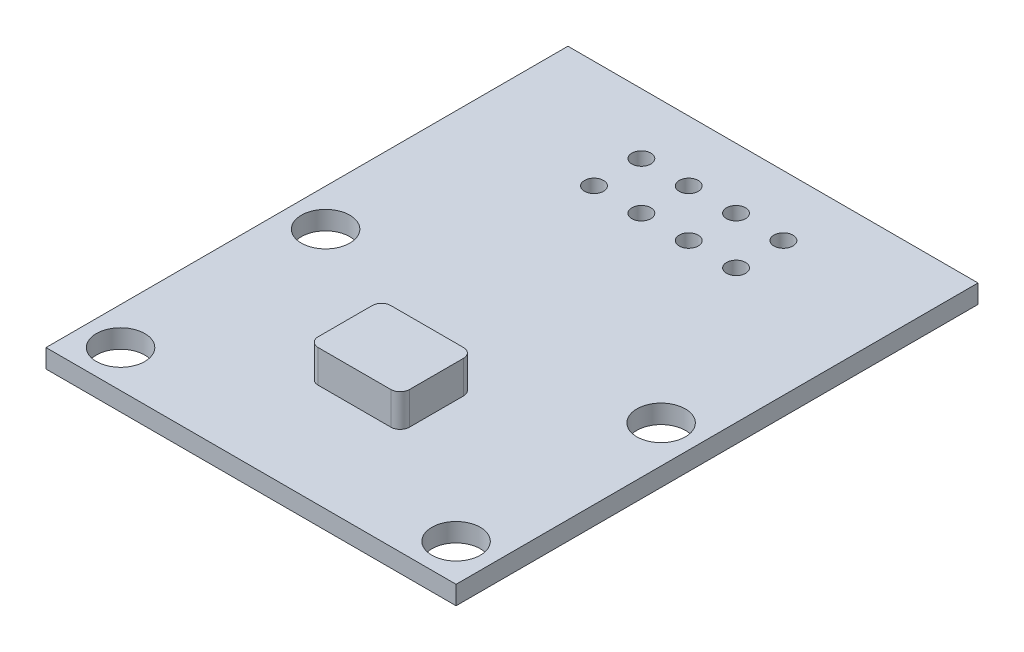
ISO-10303-21;
HEADER;
FILE_DESCRIPTION(('STEP AP214'),'2;1');
FILE_NAME('part.step','',(''),(''),'','','');
FILE_SCHEMA(('AUTOMOTIVE_DESIGN { 1 0 10303 214 1 1 1 1 }'));
ENDSEC;
DATA;
#1=APPLICATION_CONTEXT('core data for automotive mechanical design processes');
#2=APPLICATION_PROTOCOL_DEFINITION('international standard','automotive_design',2000,#1);
#3=PRODUCT_CONTEXT('',#1,'mechanical');
#4=PRODUCT('Part','Part','',(#3));
#5=PRODUCT_RELATED_PRODUCT_CATEGORY('part','',(#4));
#6=PRODUCT_DEFINITION_FORMATION('','',#4);
#7=PRODUCT_DEFINITION_CONTEXT('part definition',#1,'design');
#8=PRODUCT_DEFINITION('design','',#6,#7);
#9=PRODUCT_DEFINITION_SHAPE('','',#8);
#10=(LENGTH_UNIT() NAMED_UNIT(*) SI_UNIT(.MILLI.,.METRE.));
#11=(NAMED_UNIT(*) PLANE_ANGLE_UNIT() SI_UNIT($,.RADIAN.));
#12=(NAMED_UNIT(*) SI_UNIT($,.STERADIAN.) SOLID_ANGLE_UNIT());
#13=UNCERTAINTY_MEASURE_WITH_UNIT(LENGTH_MEASURE(1.E-05),#10,'distance_accuracy_value','');
#14=(GEOMETRIC_REPRESENTATION_CONTEXT(3) GLOBAL_UNCERTAINTY_ASSIGNED_CONTEXT((#13)) GLOBAL_UNIT_ASSIGNED_CONTEXT((#10,
#11,#12)) REPRESENTATION_CONTEXT('',''));
#15=CARTESIAN_POINT('',(0.,0.,0.));
#16=DIRECTION('',(0.,0.,1.));
#17=DIRECTION('',(1.,0.,0.));
#18=AXIS2_PLACEMENT_3D('',#15,#16,#17);
#19=CARTESIAN_POINT('',(0.,1.,0.));
#20=DIRECTION('',(0.,-1.,0.));
#21=DIRECTION('',(0.,0.,-1.));
#22=AXIS2_PLACEMENT_3D('',#19,#20,#21);
#23=PLANE('',#22);
#24=CARTESIAN_POINT('',(7.19,1.,-22.2099999999999));
#25=DIRECTION('',(0.,1.,0.));
#26=DIRECTION('',(0.,0.,1.));
#27=AXIS2_PLACEMENT_3D('',#24,#25,#26);
#28=CIRCLE('',#27,0.51);
#29=CARTESIAN_POINT('',(7.19,1.,-21.6999999999999));
#30=VERTEX_POINT('',#29);
#31=EDGE_CURVE('E146',#30,#30,#28,.T.);
#32=ORIENTED_EDGE('',*,*,#31,.F.);
#33=EDGE_LOOP('',(#32));
#34=FACE_BOUND('',#33,.T.);
#35=CARTESIAN_POINT('',(9.73,1.,-22.21));
#36=DIRECTION('',(0.,1.,0.));
#37=DIRECTION('',(0.,0.,1.));
#38=AXIS2_PLACEMENT_3D('',#35,#36,#37);
#39=CIRCLE('',#38,0.51);
#40=CARTESIAN_POINT('',(9.73,1.,-21.7));
#41=VERTEX_POINT('',#40);
#42=EDGE_CURVE('E155',#41,#41,#39,.T.);
#43=ORIENTED_EDGE('',*,*,#42,.F.);
#44=EDGE_LOOP('',(#43));
#45=FACE_BOUND('',#44,.T.);
#46=CARTESIAN_POINT('',(12.27,1.,-22.21));
#47=DIRECTION('',(0.,1.,0.));
#48=DIRECTION('',(0.,0.,1.));
#49=AXIS2_PLACEMENT_3D('',#46,#47,#48);
#50=CIRCLE('',#49,0.51);
#51=CARTESIAN_POINT('',(12.27,1.,-21.7));
#52=VERTEX_POINT('',#51);
#53=EDGE_CURVE('E161',#52,#52,#50,.T.);
#54=ORIENTED_EDGE('',*,*,#53,.F.);
#55=EDGE_LOOP('',(#54));
#56=FACE_BOUND('',#55,.T.);
#57=CARTESIAN_POINT('',(7.19,1.,-24.75));
#58=DIRECTION('',(0.,1.,0.));
#59=DIRECTION('',(0.,0.,1.));
#60=AXIS2_PLACEMENT_3D('',#57,#58,#59);
#61=CIRCLE('',#60,0.51);
#62=CARTESIAN_POINT('',(7.19,1.,-24.2399999999999));
#63=VERTEX_POINT('',#62);
#64=EDGE_CURVE('E167',#63,#63,#61,.T.);
#65=ORIENTED_EDGE('',*,*,#64,.F.);
#66=EDGE_LOOP('',(#65));
#67=FACE_BOUND('',#66,.T.);
#68=CARTESIAN_POINT('',(9.73,1.,-24.75));
#69=DIRECTION('',(0.,1.,0.));
#70=DIRECTION('',(0.,0.,1.));
#71=AXIS2_PLACEMENT_3D('',#68,#69,#70);
#72=CIRCLE('',#71,0.51);
#73=CARTESIAN_POINT('',(9.73,1.,-24.24));
#74=VERTEX_POINT('',#73);
#75=EDGE_CURVE('E173',#74,#74,#72,.T.);
#76=ORIENTED_EDGE('',*,*,#75,.F.);
#77=EDGE_LOOP('',(#76));
#78=FACE_BOUND('',#77,.T.);
#79=CARTESIAN_POINT('',(12.27,1.,-24.75));
#80=DIRECTION('',(0.,1.,0.));
#81=DIRECTION('',(0.,0.,1.));
#82=AXIS2_PLACEMENT_3D('',#79,#80,#81);
#83=CIRCLE('',#82,0.51);
#84=CARTESIAN_POINT('',(12.27,1.,-24.24));
#85=VERTEX_POINT('',#84);
#86=EDGE_CURVE('E179',#85,#85,#83,.T.);
#87=ORIENTED_EDGE('',*,*,#86,.F.);
#88=EDGE_LOOP('',(#87));
#89=FACE_BOUND('',#88,.T.);
#90=CARTESIAN_POINT('',(14.81,1.,-22.21));
#91=DIRECTION('',(0.,1.,0.));
#92=DIRECTION('',(0.,0.,1.));
#93=AXIS2_PLACEMENT_3D('',#90,#91,#92);
#94=CIRCLE('',#93,0.51);
#95=CARTESIAN_POINT('',(14.81,1.,-21.7));
#96=VERTEX_POINT('',#95);
#97=EDGE_CURVE('E185',#96,#96,#94,.T.);
#98=ORIENTED_EDGE('',*,*,#97,.F.);
#99=EDGE_LOOP('',(#98));
#100=FACE_BOUND('',#99,.T.);
#101=CARTESIAN_POINT('',(14.81,1.,-24.75));
#102=DIRECTION('',(0.,1.,0.));
#103=DIRECTION('',(0.,0.,1.));
#104=AXIS2_PLACEMENT_3D('',#101,#102,#103);
#105=CIRCLE('',#104,0.51);
#106=CARTESIAN_POINT('',(14.81,1.,-24.24));
#107=VERTEX_POINT('',#106);
#108=EDGE_CURVE('E191',#107,#107,#105,.T.);
#109=ORIENTED_EDGE('',*,*,#108,.F.);
#110=EDGE_LOOP('',(#109));
#111=FACE_BOUND('',#110,.T.);
#112=CARTESIAN_POINT('',(2.,1.,-13.));
#113=DIRECTION('',(0.,1.,0.));
#114=DIRECTION('',(0.,0.,1.));
#115=AXIS2_PLACEMENT_3D('',#112,#113,#114);
#116=CIRCLE('',#115,1.3);
#117=CARTESIAN_POINT('',(2.,1.,-11.7));
#118=VERTEX_POINT('',#117);
#119=EDGE_CURVE('E197',#118,#118,#116,.T.);
#120=ORIENTED_EDGE('',*,*,#119,.F.);
#121=EDGE_LOOP('',(#120));
#122=FACE_BOUND('',#121,.T.);
#123=CARTESIAN_POINT('',(20.,1.,-13.));
#124=DIRECTION('',(0.,1.,0.));
#125=DIRECTION('',(0.,0.,1.));
#126=AXIS2_PLACEMENT_3D('',#123,#124,#125);
#127=CIRCLE('',#126,1.3);
#128=CARTESIAN_POINT('',(20.,1.,-11.7));
#129=VERTEX_POINT('',#128);
#130=EDGE_CURVE('E203',#129,#129,#127,.T.);
#131=ORIENTED_EDGE('',*,*,#130,.F.);
#132=EDGE_LOOP('',(#131));
#133=FACE_BOUND('',#132,.T.);
#134=CARTESIAN_POINT('',(20.,1.,-2.));
#135=DIRECTION('',(0.,1.,0.));
#136=DIRECTION('',(0.,0.,1.));
#137=AXIS2_PLACEMENT_3D('',#134,#135,#136);
#138=CIRCLE('',#137,1.3);
#139=CARTESIAN_POINT('',(20.,1.,-0.700000000000002));
#140=VERTEX_POINT('',#139);
#141=EDGE_CURVE('E209',#140,#140,#138,.T.);
#142=ORIENTED_EDGE('',*,*,#141,.F.);
#143=EDGE_LOOP('',(#142));
#144=FACE_BOUND('',#143,.T.);
#145=CARTESIAN_POINT('',(2.,1.,-2.));
#146=DIRECTION('',(0.,1.,0.));
#147=DIRECTION('',(0.,0.,1.));
#148=AXIS2_PLACEMENT_3D('',#145,#146,#147);
#149=CIRCLE('',#148,1.3);
#150=CARTESIAN_POINT('',(2.,1.,-0.700000000000001));
#151=VERTEX_POINT('',#150);
#152=EDGE_CURVE('E215',#151,#151,#149,.T.);
#153=ORIENTED_EDGE('',*,*,#152,.F.);
#154=EDGE_LOOP('',(#153));
#155=FACE_BOUND('',#154,.T.);
#156=DIRECTION('',(0.,0.,1.));
#157=VECTOR('',#156,1.);
#158=CARTESIAN_POINT('',(0.,1.,0.));
#159=LINE('',#158,#157);
#160=CARTESIAN_POINT('',(0.,1.,-28.));
#161=VERTEX_POINT('',#160);
#162=CARTESIAN_POINT('',(0.,1.,0.));
#163=VERTEX_POINT('',#162);
#164=EDGE_CURVE('E221',#161,#163,#159,.T.);
#165=ORIENTED_EDGE('',*,*,#164,.T.);
#166=DIRECTION('',(1.,0.,0.));
#167=VECTOR('',#166,1.);
#168=CARTESIAN_POINT('',(0.,1.,0.));
#169=LINE('',#168,#167);
#170=CARTESIAN_POINT('',(22.,1.,0.));
#171=VERTEX_POINT('',#170);
#172=EDGE_CURVE('E224',#163,#171,#169,.T.);
#173=ORIENTED_EDGE('',*,*,#172,.T.);
#174=DIRECTION('',(0.,0.,-1.));
#175=VECTOR('',#174,1.);
#176=CARTESIAN_POINT('',(22.,1.,0.));
#177=LINE('',#176,#175);
#178=CARTESIAN_POINT('',(22.,1.,-28.));
#179=VERTEX_POINT('',#178);
#180=EDGE_CURVE('E227',#171,#179,#177,.T.);
#181=ORIENTED_EDGE('',*,*,#180,.T.);
#182=DIRECTION('',(-1.,0.,0.));
#183=VECTOR('',#182,1.);
#184=CARTESIAN_POINT('',(0.,1.,-28.));
#185=LINE('',#184,#183);
#186=EDGE_CURVE('E229',#179,#161,#185,.T.);
#187=ORIENTED_EDGE('',*,*,#186,.T.);
#188=EDGE_LOOP('',(#165,#173,#181,#187));
#189=FACE_BOUND('',#188,.T.);
#190=CARTESIAN_POINT('',(9.05,1.,-6.05));
#191=DIRECTION('',(0.,1.,0.));
#192=DIRECTION('',(0.,0.,1.));
#193=AXIS2_PLACEMENT_3D('',#190,#191,#192);
#194=CIRCLE('',#193,0.5);
#195=CARTESIAN_POINT('',(8.55,1.,-6.05000000000001));
#196=VERTEX_POINT('',#195);
#197=CARTESIAN_POINT('',(9.05,1.,-5.55));
#198=VERTEX_POINT('',#197);
#199=EDGE_CURVE('E142',#196,#198,#194,.T.);
#200=ORIENTED_EDGE('',*,*,#199,.F.);
#201=DIRECTION('',(0.,0.,1.));
#202=VECTOR('',#201,1.);
#203=CARTESIAN_POINT('',(8.55,1.,-8.94999999999999));
#204=LINE('',#203,#202);
#205=CARTESIAN_POINT('',(8.55,1.,-8.94999999999999));
#206=VERTEX_POINT('',#205);
#207=EDGE_CURVE('E139',#206,#196,#204,.T.);
#208=ORIENTED_EDGE('',*,*,#207,.F.);
#209=CARTESIAN_POINT('',(9.05,1.,-8.95));
#210=DIRECTION('',(0.,1.,0.));
#211=DIRECTION('',(0.,0.,1.));
#212=AXIS2_PLACEMENT_3D('',#209,#210,#211);
#213=CIRCLE('',#212,0.5);
#214=CARTESIAN_POINT('',(9.05,1.,-9.45));
#215=VERTEX_POINT('',#214);
#216=EDGE_CURVE('E531',#215,#206,#213,.T.);
#217=ORIENTED_EDGE('',*,*,#216,.F.);
#218=DIRECTION('',(-1.,0.,0.));
#219=VECTOR('',#218,1.);
#220=CARTESIAN_POINT('',(9.05,1.,-9.45));
#221=LINE('',#220,#219);
#222=CARTESIAN_POINT('',(12.95,1.,-9.45));
#223=VERTEX_POINT('',#222);
#224=EDGE_CURVE('E562',#223,#215,#221,.T.);
#225=ORIENTED_EDGE('',*,*,#224,.F.);
#226=CARTESIAN_POINT('',(12.95,1.,-8.95));
#227=DIRECTION('',(0.,1.,0.));
#228=DIRECTION('',(0.,0.,1.));
#229=AXIS2_PLACEMENT_3D('',#226,#227,#228);
#230=CIRCLE('',#229,0.5);
#231=CARTESIAN_POINT('',(13.45,1.,-8.95));
#232=VERTEX_POINT('',#231);
#233=EDGE_CURVE('E555',#232,#223,#230,.T.);
#234=ORIENTED_EDGE('',*,*,#233,.F.);
#235=DIRECTION('',(0.,0.,-1.));
#236=VECTOR('',#235,1.);
#237=CARTESIAN_POINT('',(13.45,1.,-8.95));
#238=LINE('',#237,#236);
#239=CARTESIAN_POINT('',(13.45,1.,-6.05));
#240=VERTEX_POINT('',#239);
#241=EDGE_CURVE('E552',#240,#232,#238,.T.);
#242=ORIENTED_EDGE('',*,*,#241,.F.);
#243=CARTESIAN_POINT('',(12.95,1.,-6.05));
#244=DIRECTION('',(0.,1.,0.));
#245=DIRECTION('',(0.,0.,-1.));
#246=AXIS2_PLACEMENT_3D('',#243,#244,#245);
#247=CIRCLE('',#246,0.5);
#248=CARTESIAN_POINT('',(12.95,1.,-5.55));
#249=VERTEX_POINT('',#248);
#250=EDGE_CURVE('E53',#249,#240,#247,.T.);
#251=ORIENTED_EDGE('',*,*,#250,.F.);
#252=DIRECTION('',(1.,0.,0.));
#253=VECTOR('',#252,1.);
#254=CARTESIAN_POINT('',(9.05,1.,-5.55));
#255=LINE('',#254,#253);
#256=EDGE_CURVE('E48',#198,#249,#255,.T.);
#257=ORIENTED_EDGE('',*,*,#256,.F.);
#258=EDGE_LOOP('',(#200,#208,#217,#225,#234,#242,#251,#257));
#259=FACE_BOUND('',#258,.T.);
#260=ADVANCED_FACE('F33',(#34,#45,#56,#67,#78,#89,#100,#111,#122,#133,#144,#155,#189,#259),#23,.F.);
#261=CARTESIAN_POINT('',(0.,0.,0.));
#262=DIRECTION('',(0.,-1.,0.));
#263=DIRECTION('',(0.,0.,-1.));
#264=AXIS2_PLACEMENT_3D('',#261,#262,#263);
#265=PLANE('',#264);
#266=CARTESIAN_POINT('',(9.73,0.,-22.21));
#267=DIRECTION('',(0.,1.,0.));
#268=DIRECTION('',(0.,0.,1.));
#269=AXIS2_PLACEMENT_3D('',#266,#267,#268);
#270=CIRCLE('',#269,0.51);
#271=CARTESIAN_POINT('',(9.73,0.,-21.7));
#272=VERTEX_POINT('',#271);
#273=EDGE_CURVE('E153',#272,#272,#270,.T.);
#274=ORIENTED_EDGE('',*,*,#273,.T.);
#275=EDGE_LOOP('',(#274));
#276=FACE_BOUND('',#275,.T.);
#277=CARTESIAN_POINT('',(7.19,0.,-24.75));
#278=DIRECTION('',(0.,1.,0.));
#279=DIRECTION('',(0.,0.,1.));
#280=AXIS2_PLACEMENT_3D('',#277,#278,#279);
#281=CIRCLE('',#280,0.51);
#282=CARTESIAN_POINT('',(7.19,0.,-24.2399999999999));
#283=VERTEX_POINT('',#282);
#284=EDGE_CURVE('E164',#283,#283,#281,.T.);
#285=ORIENTED_EDGE('',*,*,#284,.T.);
#286=EDGE_LOOP('',(#285));
#287=FACE_BOUND('',#286,.T.);
#288=CARTESIAN_POINT('',(12.27,0.,-24.75));
#289=DIRECTION('',(0.,1.,0.));
#290=DIRECTION('',(0.,0.,1.));
#291=AXIS2_PLACEMENT_3D('',#288,#289,#290);
#292=CIRCLE('',#291,0.51);
#293=CARTESIAN_POINT('',(12.27,0.,-24.24));
#294=VERTEX_POINT('',#293);
#295=EDGE_CURVE('E176',#294,#294,#292,.T.);
#296=ORIENTED_EDGE('',*,*,#295,.T.);
#297=EDGE_LOOP('',(#296));
#298=FACE_BOUND('',#297,.T.);
#299=CARTESIAN_POINT('',(14.81,0.,-24.75));
#300=DIRECTION('',(0.,1.,0.));
#301=DIRECTION('',(0.,0.,1.));
#302=AXIS2_PLACEMENT_3D('',#299,#300,#301);
#303=CIRCLE('',#302,0.51);
#304=CARTESIAN_POINT('',(14.81,0.,-24.24));
#305=VERTEX_POINT('',#304);
#306=EDGE_CURVE('E188',#305,#305,#303,.T.);
#307=ORIENTED_EDGE('',*,*,#306,.T.);
#308=EDGE_LOOP('',(#307));
#309=FACE_BOUND('',#308,.T.);
#310=CARTESIAN_POINT('',(20.,0.,-13.));
#311=DIRECTION('',(0.,1.,0.));
#312=DIRECTION('',(0.,0.,1.));
#313=AXIS2_PLACEMENT_3D('',#310,#311,#312);
#314=CIRCLE('',#313,1.3);
#315=CARTESIAN_POINT('',(20.,0.,-11.7));
#316=VERTEX_POINT('',#315);
#317=EDGE_CURVE('E200',#316,#316,#314,.T.);
#318=ORIENTED_EDGE('',*,*,#317,.T.);
#319=EDGE_LOOP('',(#318));
#320=FACE_BOUND('',#319,.T.);
#321=CARTESIAN_POINT('',(2.,0.,-2.));
#322=DIRECTION('',(0.,1.,0.));
#323=DIRECTION('',(0.,0.,1.));
#324=AXIS2_PLACEMENT_3D('',#321,#322,#323);
#325=CIRCLE('',#324,1.3);
#326=CARTESIAN_POINT('',(2.,0.,-0.700000000000001));
#327=VERTEX_POINT('',#326);
#328=EDGE_CURVE('E212',#327,#327,#325,.T.);
#329=ORIENTED_EDGE('',*,*,#328,.T.);
#330=EDGE_LOOP('',(#329));
#331=FACE_BOUND('',#330,.T.);
#332=DIRECTION('',(0.,0.,1.));
#333=VECTOR('',#332,1.);
#334=CARTESIAN_POINT('',(0.,0.,0.));
#335=LINE('',#334,#333);
#336=CARTESIAN_POINT('',(0.,0.,-28.));
#337=VERTEX_POINT('',#336);
#338=CARTESIAN_POINT('',(0.,0.,0.));
#339=VERTEX_POINT('',#338);
#340=EDGE_CURVE('E218',#337,#339,#335,.T.);
#341=ORIENTED_EDGE('',*,*,#340,.F.);
#342=DIRECTION('',(-1.,0.,0.));
#343=VECTOR('',#342,1.);
#344=CARTESIAN_POINT('',(0.,0.,-28.));
#345=LINE('',#344,#343);
#346=CARTESIAN_POINT('',(22.,0.,-28.));
#347=VERTEX_POINT('',#346);
#348=EDGE_CURVE('E225',#347,#337,#345,.T.);
#349=ORIENTED_EDGE('',*,*,#348,.F.);
#350=DIRECTION('',(0.,0.,-1.));
#351=VECTOR('',#350,1.);
#352=CARTESIAN_POINT('',(22.,0.,0.));
#353=LINE('',#352,#351);
#354=CARTESIAN_POINT('',(22.,0.,0.));
#355=VERTEX_POINT('',#354);
#356=EDGE_CURVE('E236',#355,#347,#353,.T.);
#357=ORIENTED_EDGE('',*,*,#356,.F.);
#358=DIRECTION('',(1.,0.,0.));
#359=VECTOR('',#358,1.);
#360=CARTESIAN_POINT('',(0.,0.,0.));
#361=LINE('',#360,#359);
#362=EDGE_CURVE('E234',#339,#355,#361,.T.);
#363=ORIENTED_EDGE('',*,*,#362,.F.);
#364=EDGE_LOOP('',(#341,#349,#357,#363));
#365=FACE_BOUND('',#364,.T.);
#366=CARTESIAN_POINT('',(20.,0.,-2.));
#367=DIRECTION('',(0.,1.,0.));
#368=DIRECTION('',(0.,0.,1.));
#369=AXIS2_PLACEMENT_3D('',#366,#367,#368);
#370=CIRCLE('',#369,1.3);
#371=CARTESIAN_POINT('',(20.,0.,-0.700000000000002));
#372=VERTEX_POINT('',#371);
#373=EDGE_CURVE('E206',#372,#372,#370,.T.);
#374=ORIENTED_EDGE('',*,*,#373,.T.);
#375=EDGE_LOOP('',(#374));
#376=FACE_BOUND('',#375,.T.);
#377=CARTESIAN_POINT('',(2.,0.,-13.));
#378=DIRECTION('',(0.,1.,0.));
#379=DIRECTION('',(0.,0.,1.));
#380=AXIS2_PLACEMENT_3D('',#377,#378,#379);
#381=CIRCLE('',#380,1.3);
#382=CARTESIAN_POINT('',(2.,0.,-11.7));
#383=VERTEX_POINT('',#382);
#384=EDGE_CURVE('E194',#383,#383,#381,.T.);
#385=ORIENTED_EDGE('',*,*,#384,.T.);
#386=EDGE_LOOP('',(#385));
#387=FACE_BOUND('',#386,.T.);
#388=CARTESIAN_POINT('',(14.81,0.,-22.21));
#389=DIRECTION('',(0.,1.,0.));
#390=DIRECTION('',(0.,0.,1.));
#391=AXIS2_PLACEMENT_3D('',#388,#389,#390);
#392=CIRCLE('',#391,0.51);
#393=CARTESIAN_POINT('',(14.81,0.,-21.7));
#394=VERTEX_POINT('',#393);
#395=EDGE_CURVE('E182',#394,#394,#392,.T.);
#396=ORIENTED_EDGE('',*,*,#395,.T.);
#397=EDGE_LOOP('',(#396));
#398=FACE_BOUND('',#397,.T.);
#399=CARTESIAN_POINT('',(9.73,0.,-24.75));
#400=DIRECTION('',(0.,1.,0.));
#401=DIRECTION('',(0.,0.,1.));
#402=AXIS2_PLACEMENT_3D('',#399,#400,#401);
#403=CIRCLE('',#402,0.51);
#404=CARTESIAN_POINT('',(9.73,0.,-24.24));
#405=VERTEX_POINT('',#404);
#406=EDGE_CURVE('E170',#405,#405,#403,.T.);
#407=ORIENTED_EDGE('',*,*,#406,.T.);
#408=EDGE_LOOP('',(#407));
#409=FACE_BOUND('',#408,.T.);
#410=CARTESIAN_POINT('',(12.27,0.,-22.21));
#411=DIRECTION('',(0.,1.,0.));
#412=DIRECTION('',(0.,0.,1.));
#413=AXIS2_PLACEMENT_3D('',#410,#411,#412);
#414=CIRCLE('',#413,0.51);
#415=CARTESIAN_POINT('',(12.27,0.,-21.7));
#416=VERTEX_POINT('',#415);
#417=EDGE_CURVE('E158',#416,#416,#414,.T.);
#418=ORIENTED_EDGE('',*,*,#417,.T.);
#419=EDGE_LOOP('',(#418));
#420=FACE_BOUND('',#419,.T.);
#421=CARTESIAN_POINT('',(7.19,0.,-22.2099999999999));
#422=DIRECTION('',(0.,1.,0.));
#423=DIRECTION('',(0.,0.,1.));
#424=AXIS2_PLACEMENT_3D('',#421,#422,#423);
#425=CIRCLE('',#424,0.51);
#426=CARTESIAN_POINT('',(7.19,0.,-21.6999999999999));
#427=VERTEX_POINT('',#426);
#428=EDGE_CURVE('E143',#427,#427,#425,.T.);
#429=ORIENTED_EDGE('',*,*,#428,.T.);
#430=EDGE_LOOP('',(#429));
#431=FACE_BOUND('',#430,.T.);
#432=ADVANCED_FACE('F254',(#276,#287,#298,#309,#320,#331,#365,#376,#387,#398,#409,#420,#431),
#265,.T.);
#433=CARTESIAN_POINT('',(0.,1.,0.));
#434=DIRECTION('',(1.,0.,0.));
#435=DIRECTION('',(0.,0.,-1.));
#436=AXIS2_PLACEMENT_3D('',#433,#434,#435);
#437=PLANE('',#436);
#438=ORIENTED_EDGE('',*,*,#340,.T.);
#439=DIRECTION('',(0.,-1.,0.));
#440=VECTOR('',#439,1.);
#441=CARTESIAN_POINT('',(0.,1.,0.));
#442=LINE('',#441,#440);
#443=EDGE_CURVE('E11',#163,#339,#442,.T.);
#444=ORIENTED_EDGE('',*,*,#443,.F.);
#445=ORIENTED_EDGE('',*,*,#164,.F.);
#446=DIRECTION('',(0.,-1.,0.));
#447=VECTOR('',#446,1.);
#448=CARTESIAN_POINT('',(0.,1.,-28.));
#449=LINE('',#448,#447);
#450=EDGE_CURVE('E231',#161,#337,#449,.T.);
#451=ORIENTED_EDGE('',*,*,#450,.T.);
#452=EDGE_LOOP('',(#438,#444,#445,#451));
#453=FACE_BOUND('',#452,.T.);
#454=ADVANCED_FACE('F35',(#453),#437,.F.);
#455=CARTESIAN_POINT('',(0.,1.,0.));
#456=DIRECTION('',(0.,0.,-1.));
#457=DIRECTION('',(-1.,0.,0.));
#458=AXIS2_PLACEMENT_3D('',#455,#456,#457);
#459=PLANE('',#458);
#460=ORIENTED_EDGE('',*,*,#362,.T.);
#461=DIRECTION('',(0.,-1.,0.));
#462=VECTOR('',#461,1.);
#463=CARTESIAN_POINT('',(22.,1.,0.));
#464=LINE('',#463,#462);
#465=EDGE_CURVE('E41',#171,#355,#464,.T.);
#466=ORIENTED_EDGE('',*,*,#465,.F.);
#467=ORIENTED_EDGE('',*,*,#172,.F.);
#468=ORIENTED_EDGE('',*,*,#443,.T.);
#469=EDGE_LOOP('',(#460,#466,#467,#468));
#470=FACE_BOUND('',#469,.T.);
#471=ADVANCED_FACE('F264',(#470),#459,.F.);
#472=CARTESIAN_POINT('',(22.,1.,0.));
#473=DIRECTION('',(-1.,0.,0.));
#474=DIRECTION('',(0.,0.,1.));
#475=AXIS2_PLACEMENT_3D('',#472,#473,#474);
#476=PLANE('',#475);
#477=ORIENTED_EDGE('',*,*,#356,.T.);
#478=DIRECTION('',(0.,-1.,0.));
#479=VECTOR('',#478,1.);
#480=CARTESIAN_POINT('',(22.,1.,-28.));
#481=LINE('',#480,#479);
#482=EDGE_CURVE('E241',#179,#347,#481,.T.);
#483=ORIENTED_EDGE('',*,*,#482,.F.);
#484=ORIENTED_EDGE('',*,*,#180,.F.);
#485=ORIENTED_EDGE('',*,*,#465,.T.);
#486=EDGE_LOOP('',(#477,#483,#484,#485));
#487=FACE_BOUND('',#486,.T.);
#488=ADVANCED_FACE('F248',(#487),#476,.F.);
#489=CARTESIAN_POINT('',(0.,1.,-28.));
#490=DIRECTION('',(0.,0.,1.));
#491=DIRECTION('',(1.,0.,0.));
#492=AXIS2_PLACEMENT_3D('',#489,#490,#491);
#493=PLANE('',#492);
#494=ORIENTED_EDGE('',*,*,#348,.T.);
#495=ORIENTED_EDGE('',*,*,#450,.F.);
#496=ORIENTED_EDGE('',*,*,#186,.F.);
#497=ORIENTED_EDGE('',*,*,#482,.T.);
#498=EDGE_LOOP('',(#494,#495,#496,#497));
#499=FACE_BOUND('',#498,.T.);
#500=ADVANCED_FACE('F258',(#499),#493,.F.);
#501=CARTESIAN_POINT('',(2.,1.,-2.));
#502=DIRECTION('',(0.,-1.,0.));
#503=DIRECTION('',(0.,0.,-1.));
#504=AXIS2_PLACEMENT_3D('',#501,#502,#503);
#505=CYLINDRICAL_SURFACE('',#504,1.3);
#506=ORIENTED_EDGE('',*,*,#152,.T.);
#507=EDGE_LOOP('',(#506));
#508=FACE_BOUND('',#507,.T.);
#509=ORIENTED_EDGE('',*,*,#328,.F.);
#510=EDGE_LOOP('',(#509));
#511=FACE_BOUND('',#510,.T.);
#512=ADVANCED_FACE('F282',(#508,#511),#505,.F.);
#513=CARTESIAN_POINT('',(20.,1.,-2.));
#514=DIRECTION('',(0.,-1.,0.));
#515=DIRECTION('',(0.,0.,-1.));
#516=AXIS2_PLACEMENT_3D('',#513,#514,#515);
#517=CYLINDRICAL_SURFACE('',#516,1.3);
#518=ORIENTED_EDGE('',*,*,#141,.T.);
#519=EDGE_LOOP('',(#518));
#520=FACE_BOUND('',#519,.T.);
#521=ORIENTED_EDGE('',*,*,#373,.F.);
#522=EDGE_LOOP('',(#521));
#523=FACE_BOUND('',#522,.T.);
#524=ADVANCED_FACE('F289',(#520,#523),#517,.F.);
#525=CARTESIAN_POINT('',(20.,1.,-13.));
#526=DIRECTION('',(0.,-1.,0.));
#527=DIRECTION('',(0.,0.,-1.));
#528=AXIS2_PLACEMENT_3D('',#525,#526,#527);
#529=CYLINDRICAL_SURFACE('',#528,1.3);
#530=ORIENTED_EDGE('',*,*,#130,.T.);
#531=EDGE_LOOP('',(#530));
#532=FACE_BOUND('',#531,.T.);
#533=ORIENTED_EDGE('',*,*,#317,.F.);
#534=EDGE_LOOP('',(#533));
#535=FACE_BOUND('',#534,.T.);
#536=ADVANCED_FACE('F294',(#532,#535),#529,.F.);
#537=CARTESIAN_POINT('',(2.,1.,-13.));
#538=DIRECTION('',(0.,-1.,0.));
#539=DIRECTION('',(0.,0.,-1.));
#540=AXIS2_PLACEMENT_3D('',#537,#538,#539);
#541=CYLINDRICAL_SURFACE('',#540,1.3);
#542=ORIENTED_EDGE('',*,*,#119,.T.);
#543=EDGE_LOOP('',(#542));
#544=FACE_BOUND('',#543,.T.);
#545=ORIENTED_EDGE('',*,*,#384,.F.);
#546=EDGE_LOOP('',(#545));
#547=FACE_BOUND('',#546,.T.);
#548=ADVANCED_FACE('F304',(#544,#547),#541,.F.);
#549=CARTESIAN_POINT('',(14.81,1.,-24.75));
#550=DIRECTION('',(0.,-1.,0.));
#551=DIRECTION('',(0.,0.,-1.));
#552=AXIS2_PLACEMENT_3D('',#549,#550,#551);
#553=CYLINDRICAL_SURFACE('',#552,0.51);
#554=ORIENTED_EDGE('',*,*,#108,.T.);
#555=EDGE_LOOP('',(#554));
#556=FACE_BOUND('',#555,.T.);
#557=ORIENTED_EDGE('',*,*,#306,.F.);
#558=EDGE_LOOP('',(#557));
#559=FACE_BOUND('',#558,.T.);
#560=ADVANCED_FACE('F311',(#556,#559),#553,.F.);
#561=CARTESIAN_POINT('',(14.81,1.,-22.21));
#562=DIRECTION('',(0.,-1.,0.));
#563=DIRECTION('',(0.,0.,-1.));
#564=AXIS2_PLACEMENT_3D('',#561,#562,#563);
#565=CYLINDRICAL_SURFACE('',#564,0.51);
#566=ORIENTED_EDGE('',*,*,#97,.T.);
#567=EDGE_LOOP('',(#566));
#568=FACE_BOUND('',#567,.T.);
#569=ORIENTED_EDGE('',*,*,#395,.F.);
#570=EDGE_LOOP('',(#569));
#571=FACE_BOUND('',#570,.T.);
#572=ADVANCED_FACE('F315',(#568,#571),#565,.F.);
#573=CARTESIAN_POINT('',(12.27,1.,-24.75));
#574=DIRECTION('',(0.,-1.,0.));
#575=DIRECTION('',(0.,0.,-1.));
#576=AXIS2_PLACEMENT_3D('',#573,#574,#575);
#577=CYLINDRICAL_SURFACE('',#576,0.51);
#578=ORIENTED_EDGE('',*,*,#86,.T.);
#579=EDGE_LOOP('',(#578));
#580=FACE_BOUND('',#579,.T.);
#581=ORIENTED_EDGE('',*,*,#295,.F.);
#582=EDGE_LOOP('',(#581));
#583=FACE_BOUND('',#582,.T.);
#584=ADVANCED_FACE('F319',(#580,#583),#577,.F.);
#585=CARTESIAN_POINT('',(9.73,1.,-24.75));
#586=DIRECTION('',(0.,-1.,0.));
#587=DIRECTION('',(0.,0.,-1.));
#588=AXIS2_PLACEMENT_3D('',#585,#586,#587);
#589=CYLINDRICAL_SURFACE('',#588,0.51);
#590=ORIENTED_EDGE('',*,*,#75,.T.);
#591=EDGE_LOOP('',(#590));
#592=FACE_BOUND('',#591,.T.);
#593=ORIENTED_EDGE('',*,*,#406,.F.);
#594=EDGE_LOOP('',(#593));
#595=FACE_BOUND('',#594,.T.);
#596=ADVANCED_FACE('F323',(#592,#595),#589,.F.);
#597=CARTESIAN_POINT('',(7.19,1.,-24.75));
#598=DIRECTION('',(0.,-1.,0.));
#599=DIRECTION('',(0.,0.,-1.));
#600=AXIS2_PLACEMENT_3D('',#597,#598,#599);
#601=CYLINDRICAL_SURFACE('',#600,0.51);
#602=ORIENTED_EDGE('',*,*,#64,.T.);
#603=EDGE_LOOP('',(#602));
#604=FACE_BOUND('',#603,.T.);
#605=ORIENTED_EDGE('',*,*,#284,.F.);
#606=EDGE_LOOP('',(#605));
#607=FACE_BOUND('',#606,.T.);
#608=ADVANCED_FACE('F327',(#604,#607),#601,.F.);
#609=CARTESIAN_POINT('',(12.27,1.,-22.21));
#610=DIRECTION('',(0.,-1.,0.));
#611=DIRECTION('',(0.,0.,-1.));
#612=AXIS2_PLACEMENT_3D('',#609,#610,#611);
#613=CYLINDRICAL_SURFACE('',#612,0.51);
#614=ORIENTED_EDGE('',*,*,#53,.T.);
#615=EDGE_LOOP('',(#614));
#616=FACE_BOUND('',#615,.T.);
#617=ORIENTED_EDGE('',*,*,#417,.F.);
#618=EDGE_LOOP('',(#617));
#619=FACE_BOUND('',#618,.T.);
#620=ADVANCED_FACE('F331',(#616,#619),#613,.F.);
#621=CARTESIAN_POINT('',(9.73,1.,-22.21));
#622=DIRECTION('',(0.,-1.,0.));
#623=DIRECTION('',(0.,0.,-1.));
#624=AXIS2_PLACEMENT_3D('',#621,#622,#623);
#625=CYLINDRICAL_SURFACE('',#624,0.51);
#626=ORIENTED_EDGE('',*,*,#42,.T.);
#627=EDGE_LOOP('',(#626));
#628=FACE_BOUND('',#627,.T.);
#629=ORIENTED_EDGE('',*,*,#273,.F.);
#630=EDGE_LOOP('',(#629));
#631=FACE_BOUND('',#630,.T.);
#632=ADVANCED_FACE('F335',(#628,#631),#625,.F.);
#633=CARTESIAN_POINT('',(7.19,1.,-22.2099999999999));
#634=DIRECTION('',(0.,-1.,0.));
#635=DIRECTION('',(0.,0.,-1.));
#636=AXIS2_PLACEMENT_3D('',#633,#634,#635);
#637=CYLINDRICAL_SURFACE('',#636,0.51);
#638=ORIENTED_EDGE('',*,*,#31,.T.);
#639=EDGE_LOOP('',(#638));
#640=FACE_BOUND('',#639,.T.);
#641=ORIENTED_EDGE('',*,*,#428,.F.);
#642=EDGE_LOOP('',(#641));
#643=FACE_BOUND('',#642,.T.);
#644=ADVANCED_FACE('F339',(#640,#643),#637,.F.);
#645=CARTESIAN_POINT('',(9.05,2.75,-6.05));
#646=DIRECTION('',(0.,-1.,0.));
#647=DIRECTION('',(0.,0.,-1.));
#648=AXIS2_PLACEMENT_3D('',#645,#646,#647);
#649=CYLINDRICAL_SURFACE('',#648,0.5);
#650=ORIENTED_EDGE('',*,*,#199,.T.);
#651=DIRECTION('',(0.,-1.,0.));
#652=VECTOR('',#651,1.);
#653=CARTESIAN_POINT('',(9.05,2.75,-5.55));
#654=LINE('',#653,#652);
#655=CARTESIAN_POINT('',(9.05,2.75,-5.55));
#656=VERTEX_POINT('',#655);
#657=EDGE_CURVE('E123',#656,#198,#654,.T.);
#658=ORIENTED_EDGE('',*,*,#657,.F.);
#659=CARTESIAN_POINT('',(9.05,2.75,-6.05));
#660=DIRECTION('',(0.,1.,0.));
#661=DIRECTION('',(0.,0.,1.));
#662=AXIS2_PLACEMENT_3D('',#659,#660,#661);
#663=CIRCLE('',#662,0.5);
#664=CARTESIAN_POINT('',(8.55,2.75,-6.05000000000001));
#665=VERTEX_POINT('',#664);
#666=EDGE_CURVE('E130',#665,#656,#663,.T.);
#667=ORIENTED_EDGE('',*,*,#666,.F.);
#668=DIRECTION('',(0.,-1.,0.));
#669=VECTOR('',#668,1.);
#670=CARTESIAN_POINT('',(8.55,2.75,-6.05000000000001));
#671=LINE('',#670,#669);
#672=EDGE_CURVE('E527',#665,#196,#671,.T.);
#673=ORIENTED_EDGE('',*,*,#672,.T.);
#674=EDGE_LOOP('',(#650,#658,#667,#673));
#675=FACE_BOUND('',#674,.T.);
#676=ADVANCED_FACE('F141',(#675),#649,.T.);
#677=CARTESIAN_POINT('',(9.05,2.75,-5.55));
#678=DIRECTION('',(0.,0.,-1.));
#679=DIRECTION('',(-1.,0.,0.));
#680=AXIS2_PLACEMENT_3D('',#677,#678,#679);
#681=PLANE('',#680);
#682=ORIENTED_EDGE('',*,*,#256,.T.);
#683=DIRECTION('',(0.,-1.,0.));
#684=VECTOR('',#683,1.);
#685=CARTESIAN_POINT('',(12.95,2.75,-5.55));
#686=LINE('',#685,#684);
#687=CARTESIAN_POINT('',(12.95,2.75,-5.55));
#688=VERTEX_POINT('',#687);
#689=EDGE_CURVE('E126',#688,#249,#686,.T.);
#690=ORIENTED_EDGE('',*,*,#689,.F.);
#691=DIRECTION('',(1.,0.,0.));
#692=VECTOR('',#691,1.);
#693=CARTESIAN_POINT('',(9.05,2.75,-5.55));
#694=LINE('',#693,#692);
#695=EDGE_CURVE('E119',#656,#688,#694,.T.);
#696=ORIENTED_EDGE('',*,*,#695,.F.);
#697=ORIENTED_EDGE('',*,*,#657,.T.);
#698=EDGE_LOOP('',(#682,#690,#696,#697));
#699=FACE_BOUND('',#698,.T.);
#700=ADVANCED_FACE('F121',(#699),#681,.F.);
#701=CARTESIAN_POINT('',(12.95,2.75,-6.05));
#702=DIRECTION('',(0.,-1.,0.));
#703=DIRECTION('',(0.,0.,-1.));
#704=AXIS2_PLACEMENT_3D('',#701,#702,#703);
#705=CYLINDRICAL_SURFACE('',#704,0.5);
#706=ORIENTED_EDGE('',*,*,#250,.T.);
#707=DIRECTION('',(0.,-1.,0.));
#708=VECTOR('',#707,1.);
#709=CARTESIAN_POINT('',(13.45,2.75,-6.05));
#710=LINE('',#709,#708);
#711=CARTESIAN_POINT('',(13.45,2.75,-6.05));
#712=VERTEX_POINT('',#711);
#713=EDGE_CURVE('E148',#712,#240,#710,.T.);
#714=ORIENTED_EDGE('',*,*,#713,.F.);
#715=CARTESIAN_POINT('',(12.95,2.75,-6.05));
#716=DIRECTION('',(0.,1.,0.));
#717=DIRECTION('',(0.,0.,-1.));
#718=AXIS2_PLACEMENT_3D('',#715,#716,#717);
#719=CIRCLE('',#718,0.5);
#720=EDGE_CURVE('E129',#688,#712,#719,.T.);
#721=ORIENTED_EDGE('',*,*,#720,.F.);
#722=ORIENTED_EDGE('',*,*,#689,.T.);
#723=EDGE_LOOP('',(#706,#714,#721,#722));
#724=FACE_BOUND('',#723,.T.);
#725=ADVANCED_FACE('F348',(#724),#705,.T.);
#726=CARTESIAN_POINT('',(13.45,2.75,-8.95));
#727=DIRECTION('',(-1.,0.,0.));
#728=DIRECTION('',(0.,0.,1.));
#729=AXIS2_PLACEMENT_3D('',#726,#727,#728);
#730=PLANE('',#729);
#731=ORIENTED_EDGE('',*,*,#241,.T.);
#732=DIRECTION('',(0.,-1.,0.));
#733=VECTOR('',#732,1.);
#734=CARTESIAN_POINT('',(13.45,2.75,-8.95));
#735=LINE('',#734,#733);
#736=CARTESIAN_POINT('',(13.45,2.75,-8.95));
#737=VERTEX_POINT('',#736);
#738=EDGE_CURVE('E545',#737,#232,#735,.T.);
#739=ORIENTED_EDGE('',*,*,#738,.F.);
#740=DIRECTION('',(0.,0.,-1.));
#741=VECTOR('',#740,1.);
#742=CARTESIAN_POINT('',(13.45,2.75,-8.95));
#743=LINE('',#742,#741);
#744=EDGE_CURVE('E553',#712,#737,#743,.T.);
#745=ORIENTED_EDGE('',*,*,#744,.F.);
#746=ORIENTED_EDGE('',*,*,#713,.T.);
#747=EDGE_LOOP('',(#731,#739,#745,#746));
#748=FACE_BOUND('',#747,.T.);
#749=ADVANCED_FACE('F351',(#748),#730,.F.);
#750=CARTESIAN_POINT('',(12.95,2.75,-8.95));
#751=DIRECTION('',(0.,-1.,0.));
#752=DIRECTION('',(0.,0.,-1.));
#753=AXIS2_PLACEMENT_3D('',#750,#751,#752);
#754=CYLINDRICAL_SURFACE('',#753,0.5);
#755=ORIENTED_EDGE('',*,*,#233,.T.);
#756=DIRECTION('',(0.,-1.,0.));
#757=VECTOR('',#756,1.);
#758=CARTESIAN_POINT('',(12.95,2.75,-9.45));
#759=LINE('',#758,#757);
#760=CARTESIAN_POINT('',(12.95,2.75,-9.45));
#761=VERTEX_POINT('',#760);
#762=EDGE_CURVE('E542',#761,#223,#759,.T.);
#763=ORIENTED_EDGE('',*,*,#762,.F.);
#764=CARTESIAN_POINT('',(12.95,2.75,-8.95));
#765=DIRECTION('',(0.,1.,0.));
#766=DIRECTION('',(0.,0.,1.));
#767=AXIS2_PLACEMENT_3D('',#764,#765,#766);
#768=CIRCLE('',#767,0.5);
#769=EDGE_CURVE('E570',#737,#761,#768,.T.);
#770=ORIENTED_EDGE('',*,*,#769,.F.);
#771=ORIENTED_EDGE('',*,*,#738,.T.);
#772=EDGE_LOOP('',(#755,#763,#770,#771));
#773=FACE_BOUND('',#772,.T.);
#774=ADVANCED_FACE('F355',(#773),#754,.T.);
#775=CARTESIAN_POINT('',(9.05,2.75,-9.45));
#776=DIRECTION('',(0.,0.,1.));
#777=DIRECTION('',(1.,0.,0.));
#778=AXIS2_PLACEMENT_3D('',#775,#776,#777);
#779=PLANE('',#778);
#780=ORIENTED_EDGE('',*,*,#224,.T.);
#781=DIRECTION('',(0.,-1.,0.));
#782=VECTOR('',#781,1.);
#783=CARTESIAN_POINT('',(9.05,2.75,-9.45));
#784=LINE('',#783,#782);
#785=CARTESIAN_POINT('',(9.05,2.75,-9.45));
#786=VERTEX_POINT('',#785);
#787=EDGE_CURVE('E534',#786,#215,#784,.T.);
#788=ORIENTED_EDGE('',*,*,#787,.F.);
#789=DIRECTION('',(-1.,0.,0.));
#790=VECTOR('',#789,1.);
#791=CARTESIAN_POINT('',(9.05,2.75,-9.45));
#792=LINE('',#791,#790);
#793=EDGE_CURVE('E568',#761,#786,#792,.T.);
#794=ORIENTED_EDGE('',*,*,#793,.F.);
#795=ORIENTED_EDGE('',*,*,#762,.T.);
#796=EDGE_LOOP('',(#780,#788,#794,#795));
#797=FACE_BOUND('',#796,.T.);
#798=ADVANCED_FACE('F359',(#797),#779,.F.);
#799=CARTESIAN_POINT('',(9.05,2.75,-8.95));
#800=DIRECTION('',(0.,-1.,0.));
#801=DIRECTION('',(0.,0.,-1.));
#802=AXIS2_PLACEMENT_3D('',#799,#800,#801);
#803=CYLINDRICAL_SURFACE('',#802,0.5);
#804=ORIENTED_EDGE('',*,*,#216,.T.);
#805=DIRECTION('',(0.,-1.,0.));
#806=VECTOR('',#805,1.);
#807=CARTESIAN_POINT('',(8.55,2.75,-8.94999999999999));
#808=LINE('',#807,#806);
#809=CARTESIAN_POINT('',(8.55,2.75,-8.94999999999999));
#810=VERTEX_POINT('',#809);
#811=EDGE_CURVE('E529',#810,#206,#808,.T.);
#812=ORIENTED_EDGE('',*,*,#811,.F.);
#813=CARTESIAN_POINT('',(9.05,2.75,-8.95));
#814=DIRECTION('',(0.,1.,0.));
#815=DIRECTION('',(0.,0.,1.));
#816=AXIS2_PLACEMENT_3D('',#813,#814,#815);
#817=CIRCLE('',#816,0.5);
#818=EDGE_CURVE('E536',#786,#810,#817,.T.);
#819=ORIENTED_EDGE('',*,*,#818,.F.);
#820=ORIENTED_EDGE('',*,*,#787,.T.);
#821=EDGE_LOOP('',(#804,#812,#819,#820));
#822=FACE_BOUND('',#821,.T.);
#823=ADVANCED_FACE('F363',(#822),#803,.T.);
#824=CARTESIAN_POINT('',(8.55,2.75,-8.94999999999999));
#825=DIRECTION('',(1.,0.,0.));
#826=DIRECTION('',(0.,0.,-1.));
#827=AXIS2_PLACEMENT_3D('',#824,#825,#826);
#828=PLANE('',#827);
#829=ORIENTED_EDGE('',*,*,#207,.T.);
#830=ORIENTED_EDGE('',*,*,#672,.F.);
#831=DIRECTION('',(0.,0.,1.));
#832=VECTOR('',#831,1.);
#833=CARTESIAN_POINT('',(8.55,2.75,-8.94999999999999));
#834=LINE('',#833,#832);
#835=EDGE_CURVE('E135',#810,#665,#834,.T.);
#836=ORIENTED_EDGE('',*,*,#835,.F.);
#837=ORIENTED_EDGE('',*,*,#811,.T.);
#838=EDGE_LOOP('',(#829,#830,#836,#837));
#839=FACE_BOUND('',#838,.T.);
#840=ADVANCED_FACE('F367',(#839),#828,.F.);
#841=CARTESIAN_POINT('',(9.05,2.75,-6.05));
#842=DIRECTION('',(0.,1.,0.));
#843=DIRECTION('',(0.,0.,1.));
#844=AXIS2_PLACEMENT_3D('',#841,#842,#843);
#845=PLANE('',#844);
#846=ORIENTED_EDGE('',*,*,#666,.T.);
#847=ORIENTED_EDGE('',*,*,#695,.T.);
#848=ORIENTED_EDGE('',*,*,#720,.T.);
#849=ORIENTED_EDGE('',*,*,#744,.T.);
#850=ORIENTED_EDGE('',*,*,#769,.T.);
#851=ORIENTED_EDGE('',*,*,#793,.T.);
#852=ORIENTED_EDGE('',*,*,#818,.T.);
#853=ORIENTED_EDGE('',*,*,#835,.T.);
#854=EDGE_LOOP('',(#846,#847,#848,#849,#850,#851,#852,#853));
#855=FACE_BOUND('',#854,.T.);
#856=ADVANCED_FACE('F133',(#855),#845,.T.);
#857=CLOSED_SHELL('',(#260,#432,#454,#471,#488,#500,#512,#524,#536,#548,#560,#572,#584,#596,
#608,#620,#632,#644,#676,#700,#725,#749,#774,#798,#823,#840,#856));
#858=MANIFOLD_SOLID_BREP('B2',#857);
#859=ADVANCED_BREP_SHAPE_REPRESENTATION('',(#18,#858),#14);
#860=SHAPE_DEFINITION_REPRESENTATION(#9,#859);
ENDSEC;
END-ISO-10303-21;
